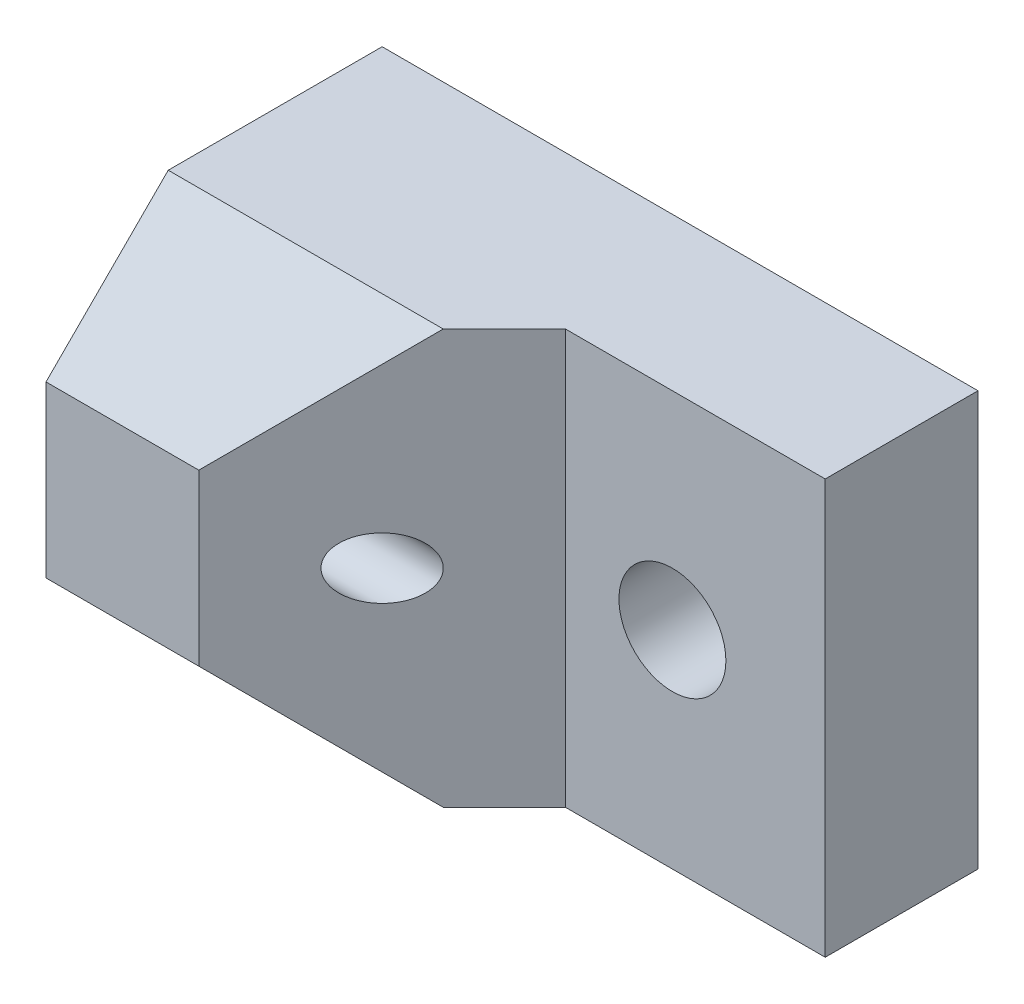
ISO-10303-21;
HEADER;
FILE_DESCRIPTION(('STEP AP214'),'2;1');
FILE_NAME('part.step','',(''),(''),'','','');
FILE_SCHEMA(('AUTOMOTIVE_DESIGN { 1 0 10303 214 1 1 1 1 }'));
ENDSEC;
DATA;
#1=APPLICATION_CONTEXT('core data for automotive mechanical design processes');
#2=APPLICATION_PROTOCOL_DEFINITION('international standard','automotive_design',2000,#1);
#3=PRODUCT_CONTEXT('',#1,'mechanical');
#4=PRODUCT('Part','Part','',(#3));
#5=PRODUCT_RELATED_PRODUCT_CATEGORY('part','',(#4));
#6=PRODUCT_DEFINITION_FORMATION('','',#4);
#7=PRODUCT_DEFINITION_CONTEXT('part definition',#1,'design');
#8=PRODUCT_DEFINITION('design','',#6,#7);
#9=PRODUCT_DEFINITION_SHAPE('','',#8);
#10=(LENGTH_UNIT() NAMED_UNIT(*) SI_UNIT(.MILLI.,.METRE.));
#11=(NAMED_UNIT(*) PLANE_ANGLE_UNIT() SI_UNIT($,.RADIAN.));
#12=(NAMED_UNIT(*) SI_UNIT($,.STERADIAN.) SOLID_ANGLE_UNIT());
#13=UNCERTAINTY_MEASURE_WITH_UNIT(LENGTH_MEASURE(1.E-05),#10,'distance_accuracy_value','');
#14=(GEOMETRIC_REPRESENTATION_CONTEXT(3) GLOBAL_UNCERTAINTY_ASSIGNED_CONTEXT((#13)) GLOBAL_UNIT_ASSIGNED_CONTEXT((#10,
#11,#12)) REPRESENTATION_CONTEXT('',''));
#15=CARTESIAN_POINT('',(0.,0.,0.));
#16=DIRECTION('',(0.,0.,1.));
#17=DIRECTION('',(1.,0.,0.));
#18=AXIS2_PLACEMENT_3D('',#15,#16,#17);
#19=CARTESIAN_POINT('',(0.,0.,5.));
#20=DIRECTION('',(0.,0.,1.));
#21=DIRECTION('',(1.,0.,0.));
#22=AXIS2_PLACEMENT_3D('',#19,#20,#21);
#23=PLANE('',#22);
#24=CARTESIAN_POINT('',(-20.9218584512682,-15.778174593052,5.));
#25=DIRECTION('',(0.,0.,1.));
#26=DIRECTION('',(1.,0.,0.));
#27=AXIS2_PLACEMENT_3D('',#24,#25,#26);
#28=CIRCLE('',#27,1.75);
#29=CARTESIAN_POINT('',(-19.1718584512682,-15.778174593052,5.));
#30=VERTEX_POINT('',#29);
#31=EDGE_CURVE('E161',#30,#30,#28,.T.);
#32=ORIENTED_EDGE('',*,*,#31,.F.);
#33=EDGE_LOOP('',(#32));
#34=FACE_BOUND('',#33,.T.);
#35=DIRECTION('',(-1.,0.,0.));
#36=VECTOR('',#35,1.);
#37=CARTESIAN_POINT('',(-35.4218584512682,-9.00000000000002,5.));
#38=LINE('',#37,#36);
#39=CARTESIAN_POINT('',(-15.9218584512682,-9.00000000000002,5.));
#40=VERTEX_POINT('',#39);
#41=CARTESIAN_POINT('',(-24.4218584512681,-9.00000000000002,5.));
#42=VERTEX_POINT('',#41);
#43=EDGE_CURVE('E175',#40,#42,#38,.T.);
#44=ORIENTED_EDGE('',*,*,#43,.T.);
#45=DIRECTION('',(0.,-1.,0.));
#46=VECTOR('',#45,1.);
#47=CARTESIAN_POINT('',(-24.4218584512681,0.,5.));
#48=LINE('',#47,#46);
#49=CARTESIAN_POINT('',(-24.4218584512681,-22.5563491861041,5.));
#50=VERTEX_POINT('',#49);
#51=EDGE_CURVE('E208',#42,#50,#48,.T.);
#52=ORIENTED_EDGE('',*,*,#51,.T.);
#53=DIRECTION('',(1.,0.,0.));
#54=VECTOR('',#53,1.);
#55=CARTESIAN_POINT('',(-35.4218584512682,-22.5563491861041,5.));
#56=LINE('',#55,#54);
#57=CARTESIAN_POINT('',(-15.9218584512682,-22.5563491861041,5.));
#58=VERTEX_POINT('',#57);
#59=EDGE_CURVE('E170',#50,#58,#56,.T.);
#60=ORIENTED_EDGE('',*,*,#59,.T.);
#61=DIRECTION('',(0.,1.,0.));
#62=VECTOR('',#61,1.);
#63=CARTESIAN_POINT('',(-15.9218584512682,-9.00000000000002,5.));
#64=LINE('',#63,#62);
#65=EDGE_CURVE('E172',#58,#40,#64,.T.);
#66=ORIENTED_EDGE('',*,*,#65,.T.);
#67=EDGE_LOOP('',(#44,#52,#60,#66));
#68=FACE_BOUND('',#67,.T.);
#69=ADVANCED_FACE('F39',(#34,#68),#23,.T.);
#70=CARTESIAN_POINT('',(0.,0.,0.));
#71=DIRECTION('',(0.,0.,1.));
#72=DIRECTION('',(1.,0.,0.));
#73=AXIS2_PLACEMENT_3D('',#70,#71,#72);
#74=PLANE('',#73);
#75=CARTESIAN_POINT('',(-20.9218584512682,-15.778174593052,0.));
#76=DIRECTION('',(0.,0.,1.));
#77=DIRECTION('',(1.,0.,0.));
#78=AXIS2_PLACEMENT_3D('',#75,#76,#77);
#79=CIRCLE('',#78,1.75);
#80=CARTESIAN_POINT('',(-19.1718584512682,-15.778174593052,0.));
#81=VERTEX_POINT('',#80);
#82=EDGE_CURVE('E158',#81,#81,#79,.T.);
#83=ORIENTED_EDGE('',*,*,#82,.T.);
#84=EDGE_LOOP('',(#83));
#85=FACE_BOUND('',#84,.T.);
#86=DIRECTION('',(-1.,0.,0.));
#87=VECTOR('',#86,1.);
#88=CARTESIAN_POINT('',(-29.4218584512682,-17.278174593052,0.));
#89=LINE('',#88,#87);
#90=CARTESIAN_POINT('',(-29.4218584512682,-17.278174593052,0.));
#91=VERTEX_POINT('',#90);
#92=CARTESIAN_POINT('',(-35.4218584512682,-17.278174593052,0.));
#93=VERTEX_POINT('',#92);
#94=EDGE_CURVE('E157',#91,#93,#89,.T.);
#95=ORIENTED_EDGE('',*,*,#94,.F.);
#96=DIRECTION('',(0.,-1.,0.));
#97=VECTOR('',#96,1.);
#98=CARTESIAN_POINT('',(-29.4218584512682,-17.278174593052,0.));
#99=LINE('',#98,#97);
#100=CARTESIAN_POINT('',(-29.4218584512682,-14.2781745930521,0.));
#101=VERTEX_POINT('',#100);
#102=EDGE_CURVE('E154',#101,#91,#99,.T.);
#103=ORIENTED_EDGE('',*,*,#102,.F.);
#104=DIRECTION('',(1.,0.,0.));
#105=VECTOR('',#104,1.);
#106=CARTESIAN_POINT('',(-29.4218584512682,-14.2781745930521,0.));
#107=LINE('',#106,#105);
#108=CARTESIAN_POINT('',(-35.4218584512682,-14.2781745930521,0.));
#109=VERTEX_POINT('',#108);
#110=EDGE_CURVE('E240',#109,#101,#107,.T.);
#111=ORIENTED_EDGE('',*,*,#110,.F.);
#112=DIRECTION('',(0.,-1.,0.));
#113=VECTOR('',#112,1.);
#114=CARTESIAN_POINT('',(-35.4218584512682,-9.00000000000002,0.));
#115=LINE('',#114,#113);
#116=CARTESIAN_POINT('',(-35.4218584512682,-9.00000000000002,0.));
#117=VERTEX_POINT('',#116);
#118=EDGE_CURVE('E179',#117,#109,#115,.T.);
#119=ORIENTED_EDGE('',*,*,#118,.F.);
#120=DIRECTION('',(-1.,0.,0.));
#121=VECTOR('',#120,1.);
#122=CARTESIAN_POINT('',(-35.4218584512682,-9.00000000000002,0.));
#123=LINE('',#122,#121);
#124=CARTESIAN_POINT('',(-15.9218584512682,-9.00000000000002,0.));
#125=VERTEX_POINT('',#124);
#126=EDGE_CURVE('E173',#125,#117,#123,.T.);
#127=ORIENTED_EDGE('',*,*,#126,.F.);
#128=DIRECTION('',(0.,1.,0.));
#129=VECTOR('',#128,1.);
#130=CARTESIAN_POINT('',(-15.9218584512682,-9.00000000000002,0.));
#131=LINE('',#130,#129);
#132=CARTESIAN_POINT('',(-15.9218584512682,-22.5563491861041,0.));
#133=VERTEX_POINT('',#132);
#134=EDGE_CURVE('E183',#133,#125,#131,.T.);
#135=ORIENTED_EDGE('',*,*,#134,.F.);
#136=DIRECTION('',(1.,0.,0.));
#137=VECTOR('',#136,1.);
#138=CARTESIAN_POINT('',(-35.4218584512682,-22.5563491861041,0.));
#139=LINE('',#138,#137);
#140=CARTESIAN_POINT('',(-35.4218584512682,-22.5563491861041,0.));
#141=VERTEX_POINT('',#140);
#142=EDGE_CURVE('E181',#141,#133,#139,.T.);
#143=ORIENTED_EDGE('',*,*,#142,.F.);
#144=EDGE_CURVE('E168',#93,#141,#115,.T.);
#145=ORIENTED_EDGE('',*,*,#144,.F.);
#146=EDGE_LOOP('',(#95,#103,#111,#119,#127,#135,#143,#145));
#147=FACE_BOUND('',#146,.T.);
#148=ADVANCED_FACE('F237',(#85,#147),#74,.F.);
#149=CARTESIAN_POINT('',(-35.4218584512682,-9.00000000000002,5.));
#150=DIRECTION('',(1.,0.,0.));
#151=DIRECTION('',(0.,0.,-1.));
#152=AXIS2_PLACEMENT_3D('',#149,#150,#151);
#153=PLANE('',#152);
#154=DIRECTION('',(0.,0.,-1.));
#155=VECTOR('',#154,1.);
#156=CARTESIAN_POINT('',(-35.4218584512682,-22.5563491861041,5.));
#157=LINE('',#156,#155);
#158=CARTESIAN_POINT('',(-35.4218584512682,-22.5563491861041,7.00000000000001));
#159=VERTEX_POINT('',#158);
#160=EDGE_CURVE('E194',#159,#141,#157,.T.);
#161=ORIENTED_EDGE('',*,*,#160,.F.);
#162=DIRECTION('',(0.,0.707106781186549,0.707106781186546));
#163=VECTOR('',#162,1.);
#164=CARTESIAN_POINT('',(-35.4218584512682,-22.5563491861041,7.00000000000001));
#165=LINE('',#164,#163);
#166=CARTESIAN_POINT('',(-35.4218584512682,-18.5563491861041,11.));
#167=VERTEX_POINT('',#166);
#168=EDGE_CURVE('E199',#159,#167,#165,.T.);
#169=ORIENTED_EDGE('',*,*,#168,.T.);
#170=DIRECTION('',(0.,1.,0.));
#171=VECTOR('',#170,1.);
#172=CARTESIAN_POINT('',(-35.4218584512682,-9.00000000000002,11.));
#173=LINE('',#172,#171);
#174=CARTESIAN_POINT('',(-35.4218584512682,-13.,11.));
#175=VERTEX_POINT('',#174);
#176=EDGE_CURVE('E265',#167,#175,#173,.T.);
#177=ORIENTED_EDGE('',*,*,#176,.T.);
#178=DIRECTION('',(0.,0.707106781186546,-0.707106781186549));
#179=VECTOR('',#178,1.);
#180=CARTESIAN_POINT('',(-35.4218584512682,-13.,11.));
#181=LINE('',#180,#179);
#182=CARTESIAN_POINT('',(-35.4218584512682,-9.00000000000002,6.99999999999998));
#183=VERTEX_POINT('',#182);
#184=EDGE_CURVE('E197',#175,#183,#181,.T.);
#185=ORIENTED_EDGE('',*,*,#184,.T.);
#186=DIRECTION('',(0.,0.,-1.));
#187=VECTOR('',#186,1.);
#188=CARTESIAN_POINT('',(-35.4218584512682,-9.00000000000002,5.));
#189=LINE('',#188,#187);
#190=EDGE_CURVE('E178',#183,#117,#189,.T.);
#191=ORIENTED_EDGE('',*,*,#190,.T.);
#192=ORIENTED_EDGE('',*,*,#118,.T.);
#193=DIRECTION('',(0.,0.,1.));
#194=VECTOR('',#193,1.);
#195=CARTESIAN_POINT('',(-35.4218584512682,-14.2781745930521,-2.));
#196=LINE('',#195,#194);
#197=CARTESIAN_POINT('',(-35.4218584512682,-14.2781745930521,-2.));
#198=VERTEX_POINT('',#197);
#199=EDGE_CURVE('E141',#198,#109,#196,.T.);
#200=ORIENTED_EDGE('',*,*,#199,.F.);
#201=DIRECTION('',(0.,1.,0.));
#202=VECTOR('',#201,1.);
#203=CARTESIAN_POINT('',(-35.4218584512682,-17.278174593052,-2.));
#204=LINE('',#203,#202);
#205=CARTESIAN_POINT('',(-35.4218584512682,-17.278174593052,-2.));
#206=VERTEX_POINT('',#205);
#207=EDGE_CURVE('E130',#206,#198,#204,.T.);
#208=ORIENTED_EDGE('',*,*,#207,.F.);
#209=DIRECTION('',(0.,0.,1.));
#210=VECTOR('',#209,1.);
#211=CARTESIAN_POINT('',(-35.4218584512682,-17.278174593052,-2.));
#212=LINE('',#211,#210);
#213=EDGE_CURVE('E137',#206,#93,#212,.T.);
#214=ORIENTED_EDGE('',*,*,#213,.T.);
#215=ORIENTED_EDGE('',*,*,#144,.T.);
#216=EDGE_LOOP('',(#161,#169,#177,#185,#191,#192,#200,#208,#214,#215));
#217=FACE_BOUND('',#216,.T.);
#218=CARTESIAN_POINT('',(-35.4218584512682,-15.778174593052,8.));
#219=DIRECTION('',(-1.,0.,0.));
#220=DIRECTION('',(0.,0.,1.));
#221=AXIS2_PLACEMENT_3D('',#218,#219,#220);
#222=CIRCLE('',#221,1.);
#223=CARTESIAN_POINT('',(-35.4218584512682,-15.778174593052,9.));
#224=VERTEX_POINT('',#223);
#225=EDGE_CURVE('E269',#224,#224,#222,.T.);
#226=ORIENTED_EDGE('',*,*,#225,.F.);
#227=EDGE_LOOP('',(#226));
#228=FACE_BOUND('',#227,.T.);
#229=ADVANCED_FACE('F133',(#217,#228),#153,.F.);
#230=CARTESIAN_POINT('',(-35.4218584512682,-22.5563491861041,5.));
#231=DIRECTION('',(0.,1.,0.));
#232=DIRECTION('',(0.,0.,1.));
#233=AXIS2_PLACEMENT_3D('',#230,#231,#232);
#234=PLANE('',#233);
#235=ORIENTED_EDGE('',*,*,#59,.F.);
#236=DIRECTION('',(-0.707106781186551,0.,0.707106781186544));
#237=VECTOR('',#236,1.);
#238=CARTESIAN_POINT('',(-29.9218584512682,-22.5563491861041,10.5));
#239=LINE('',#238,#237);
#240=CARTESIAN_POINT('',(-26.4218584512681,-22.5563491861041,7.00000000000001));
#241=VERTEX_POINT('',#240);
#242=EDGE_CURVE('E211',#50,#241,#239,.T.);
#243=ORIENTED_EDGE('',*,*,#242,.T.);
#244=DIRECTION('',(-1.,0.,0.));
#245=VECTOR('',#244,1.);
#246=CARTESIAN_POINT('',(-35.4218584512682,-22.5563491861041,7.00000000000001));
#247=LINE('',#246,#245);
#248=EDGE_CURVE('E63',#241,#159,#247,.T.);
#249=ORIENTED_EDGE('',*,*,#248,.T.);
#250=ORIENTED_EDGE('',*,*,#160,.T.);
#251=ORIENTED_EDGE('',*,*,#142,.T.);
#252=DIRECTION('',(0.,0.,-1.));
#253=VECTOR('',#252,1.);
#254=CARTESIAN_POINT('',(-15.9218584512682,-22.5563491861041,5.));
#255=LINE('',#254,#253);
#256=EDGE_CURVE('E191',#58,#133,#255,.T.);
#257=ORIENTED_EDGE('',*,*,#256,.F.);
#258=EDGE_LOOP('',(#235,#243,#249,#250,#251,#257));
#259=FACE_BOUND('',#258,.T.);
#260=ADVANCED_FACE('F259',(#259),#234,.F.);
#261=CARTESIAN_POINT('',(-15.9218584512682,-9.00000000000002,5.));
#262=DIRECTION('',(-1.,0.,0.));
#263=DIRECTION('',(0.,0.,1.));
#264=AXIS2_PLACEMENT_3D('',#261,#262,#263);
#265=PLANE('',#264);
#266=ORIENTED_EDGE('',*,*,#134,.T.);
#267=DIRECTION('',(0.,0.,-1.));
#268=VECTOR('',#267,1.);
#269=CARTESIAN_POINT('',(-15.9218584512682,-9.00000000000002,5.));
#270=LINE('',#269,#268);
#271=EDGE_CURVE('E188',#40,#125,#270,.T.);
#272=ORIENTED_EDGE('',*,*,#271,.F.);
#273=ORIENTED_EDGE('',*,*,#65,.F.);
#274=ORIENTED_EDGE('',*,*,#256,.T.);
#275=EDGE_LOOP('',(#266,#272,#273,#274));
#276=FACE_BOUND('',#275,.T.);
#277=ADVANCED_FACE('F232',(#276),#265,.F.);
#278=CARTESIAN_POINT('',(-35.4218584512682,-9.00000000000002,5.));
#279=DIRECTION('',(0.,-1.,0.));
#280=DIRECTION('',(0.,0.,-1.));
#281=AXIS2_PLACEMENT_3D('',#278,#279,#280);
#282=PLANE('',#281);
#283=ORIENTED_EDGE('',*,*,#190,.F.);
#284=DIRECTION('',(1.,0.,0.));
#285=VECTOR('',#284,1.);
#286=CARTESIAN_POINT('',(-30.4218584512682,-9.00000000000002,6.99999999999998));
#287=LINE('',#286,#285);
#288=CARTESIAN_POINT('',(-26.4218584512681,-9.00000000000002,6.99999999999998));
#289=VERTEX_POINT('',#288);
#290=EDGE_CURVE('E55',#183,#289,#287,.T.);
#291=ORIENTED_EDGE('',*,*,#290,.T.);
#292=DIRECTION('',(0.707106781186551,0.,-0.707106781186544));
#293=VECTOR('',#292,1.);
#294=CARTESIAN_POINT('',(-29.9218584512682,-9.00000000000002,10.5));
#295=LINE('',#294,#293);
#296=EDGE_CURVE('E11',#289,#42,#295,.T.);
#297=ORIENTED_EDGE('',*,*,#296,.T.);
#298=ORIENTED_EDGE('',*,*,#43,.F.);
#299=ORIENTED_EDGE('',*,*,#271,.T.);
#300=ORIENTED_EDGE('',*,*,#126,.T.);
#301=EDGE_LOOP('',(#283,#291,#297,#298,#299,#300));
#302=FACE_BOUND('',#301,.T.);
#303=ADVANCED_FACE('F225',(#302),#282,.F.);
#304=CARTESIAN_POINT('',(-20.9218584512682,-15.778174593052,5.));
#305=DIRECTION('',(0.,0.,-1.));
#306=DIRECTION('',(-1.,0.,0.));
#307=AXIS2_PLACEMENT_3D('',#304,#305,#306);
#308=CYLINDRICAL_SURFACE('',#307,1.75);
#309=ORIENTED_EDGE('',*,*,#31,.T.);
#310=EDGE_LOOP('',(#309));
#311=FACE_BOUND('',#310,.T.);
#312=ORIENTED_EDGE('',*,*,#82,.F.);
#313=EDGE_LOOP('',(#312));
#314=FACE_BOUND('',#313,.T.);
#315=ADVANCED_FACE('F292',(#311,#314),#308,.F.);
#316=CARTESIAN_POINT('',(-29.4218584512682,-17.278174593052,-2.));
#317=DIRECTION('',(0.,1.,0.));
#318=DIRECTION('',(0.,0.,1.));
#319=AXIS2_PLACEMENT_3D('',#316,#317,#318);
#320=PLANE('',#319);
#321=ORIENTED_EDGE('',*,*,#94,.T.);
#322=ORIENTED_EDGE('',*,*,#213,.F.);
#323=DIRECTION('',(-1.,0.,0.));
#324=VECTOR('',#323,1.);
#325=CARTESIAN_POINT('',(-29.4218584512682,-17.278174593052,-2.));
#326=LINE('',#325,#324);
#327=CARTESIAN_POINT('',(-29.4218584512682,-17.278174593052,-2.));
#328=VERTEX_POINT('',#327);
#329=EDGE_CURVE('E145',#328,#206,#326,.T.);
#330=ORIENTED_EDGE('',*,*,#329,.F.);
#331=DIRECTION('',(0.,0.,1.));
#332=VECTOR('',#331,1.);
#333=CARTESIAN_POINT('',(-29.4218584512682,-17.278174593052,-2.));
#334=LINE('',#333,#332);
#335=EDGE_CURVE('E246',#328,#91,#334,.T.);
#336=ORIENTED_EDGE('',*,*,#335,.T.);
#337=EDGE_LOOP('',(#321,#322,#330,#336));
#338=FACE_BOUND('',#337,.T.);
#339=ADVANCED_FACE('F156',(#338),#320,.F.);
#340=CARTESIAN_POINT('',(-29.4218584512682,-14.2781745930521,-2.));
#341=DIRECTION('',(0.,-1.,0.));
#342=DIRECTION('',(0.,0.,-1.));
#343=AXIS2_PLACEMENT_3D('',#340,#341,#342);
#344=PLANE('',#343);
#345=ORIENTED_EDGE('',*,*,#110,.T.);
#346=DIRECTION('',(0.,0.,1.));
#347=VECTOR('',#346,1.);
#348=CARTESIAN_POINT('',(-29.4218584512682,-14.2781745930521,-2.));
#349=LINE('',#348,#347);
#350=CARTESIAN_POINT('',(-29.4218584512682,-14.2781745930521,-2.));
#351=VERTEX_POINT('',#350);
#352=EDGE_CURVE('E163',#351,#101,#349,.T.);
#353=ORIENTED_EDGE('',*,*,#352,.F.);
#354=DIRECTION('',(1.,0.,0.));
#355=VECTOR('',#354,1.);
#356=CARTESIAN_POINT('',(-29.4218584512682,-14.2781745930521,-2.));
#357=LINE('',#356,#355);
#358=EDGE_CURVE('E144',#198,#351,#357,.T.);
#359=ORIENTED_EDGE('',*,*,#358,.F.);
#360=ORIENTED_EDGE('',*,*,#199,.T.);
#361=EDGE_LOOP('',(#345,#353,#359,#360));
#362=FACE_BOUND('',#361,.T.);
#363=ADVANCED_FACE('F242',(#362),#344,.F.);
#364=CARTESIAN_POINT('',(-29.4218584512682,-17.278174593052,-2.));
#365=DIRECTION('',(-1.,0.,0.));
#366=DIRECTION('',(0.,0.,1.));
#367=AXIS2_PLACEMENT_3D('',#364,#365,#366);
#368=PLANE('',#367);
#369=ORIENTED_EDGE('',*,*,#102,.T.);
#370=ORIENTED_EDGE('',*,*,#335,.F.);
#371=DIRECTION('',(0.,-1.,0.));
#372=VECTOR('',#371,1.);
#373=CARTESIAN_POINT('',(-29.4218584512682,-17.278174593052,-2.));
#374=LINE('',#373,#372);
#375=EDGE_CURVE('E150',#351,#328,#374,.T.);
#376=ORIENTED_EDGE('',*,*,#375,.F.);
#377=ORIENTED_EDGE('',*,*,#352,.T.);
#378=EDGE_LOOP('',(#369,#370,#376,#377));
#379=FACE_BOUND('',#378,.T.);
#380=ADVANCED_FACE('F255',(#379),#368,.F.);
#381=CARTESIAN_POINT('',(0.,0.,-2.));
#382=DIRECTION('',(0.,0.,-1.));
#383=DIRECTION('',(-1.,0.,0.));
#384=AXIS2_PLACEMENT_3D('',#381,#382,#383);
#385=PLANE('',#384);
#386=ORIENTED_EDGE('',*,*,#329,.T.);
#387=ORIENTED_EDGE('',*,*,#207,.T.);
#388=ORIENTED_EDGE('',*,*,#358,.T.);
#389=ORIENTED_EDGE('',*,*,#375,.T.);
#390=EDGE_LOOP('',(#386,#387,#388,#389));
#391=FACE_BOUND('',#390,.T.);
#392=ADVANCED_FACE('F148',(#391),#385,.T.);
#393=CARTESIAN_POINT('',(-30.4218584512682,-9.00000000000002,11.));
#394=DIRECTION('',(0.,0.,1.));
#395=DIRECTION('',(0.,-1.,0.));
#396=AXIS2_PLACEMENT_3D('',#393,#394,#395);
#397=PLANE('',#396);
#398=ORIENTED_EDGE('',*,*,#176,.F.);
#399=DIRECTION('',(1.,0.,0.));
#400=VECTOR('',#399,1.);
#401=CARTESIAN_POINT('',(-30.4218584512682,-18.5563491861041,11.));
#402=LINE('',#401,#400);
#403=CARTESIAN_POINT('',(-30.4218584512682,-18.5563491861041,11.));
#404=VERTEX_POINT('',#403);
#405=EDGE_CURVE('E204',#167,#404,#402,.T.);
#406=ORIENTED_EDGE('',*,*,#405,.T.);
#407=DIRECTION('',(0.,1.,0.));
#408=VECTOR('',#407,1.);
#409=CARTESIAN_POINT('',(-30.4218584512682,-9.00000000000002,11.));
#410=LINE('',#409,#408);
#411=CARTESIAN_POINT('',(-30.4218584512682,-13.,11.));
#412=VERTEX_POINT('',#411);
#413=EDGE_CURVE('E250',#404,#412,#410,.T.);
#414=ORIENTED_EDGE('',*,*,#413,.T.);
#415=DIRECTION('',(-1.,0.,0.));
#416=VECTOR('',#415,1.);
#417=CARTESIAN_POINT('',(-35.4218584512682,-13.,11.));
#418=LINE('',#417,#416);
#419=EDGE_CURVE('E201',#412,#175,#418,.T.);
#420=ORIENTED_EDGE('',*,*,#419,.T.);
#421=EDGE_LOOP('',(#398,#406,#414,#420));
#422=FACE_BOUND('',#421,.T.);
#423=ADVANCED_FACE('F264',(#422),#397,.T.);
#424=CARTESIAN_POINT('',(-30.4218584512682,-15.778174593052,8.));
#425=DIRECTION('',(-1.,0.,0.));
#426=DIRECTION('',(0.,0.,1.));
#427=AXIS2_PLACEMENT_3D('',#424,#425,#426);
#428=CYLINDRICAL_SURFACE('',#427,1.);
#429=CARTESIAN_POINT('',(-27.4218584512681,-15.778174593052,8.));
#430=DIRECTION('',(-0.707106781186544,0.,-0.707106781186551));
#431=DIRECTION('',(-0.707106781186551,0.,0.707106781186544));
#432=AXIS2_PLACEMENT_3D('',#429,#430,#431);
#433=ELLIPSE('',#432,1.4142135623731,1.);
#434=CARTESIAN_POINT('',(-28.4218584512682,-15.778174593052,9.));
#435=VERTEX_POINT('',#434);
#436=EDGE_CURVE('E44',#435,#435,#433,.T.);
#437=ORIENTED_EDGE('',*,*,#436,.F.);
#438=EDGE_LOOP('',(#437));
#439=FACE_BOUND('',#438,.T.);
#440=ORIENTED_EDGE('',*,*,#225,.T.);
#441=EDGE_LOOP('',(#440));
#442=FACE_BOUND('',#441,.T.);
#443=ADVANCED_FACE('F274',(#439,#442),#428,.F.);
#444=CARTESIAN_POINT('',(-35.4218584512682,-22.5563491861041,7.00000000000001));
#445=DIRECTION('',(0.,-0.707106781186546,0.707106781186549));
#446=DIRECTION('',(1.,0.,0.));
#447=AXIS2_PLACEMENT_3D('',#444,#445,#446);
#448=PLANE('',#447);
#449=ORIENTED_EDGE('',*,*,#248,.F.);
#450=DIRECTION('',(-0.577350269189629,0.577350269189626,0.577350269189623));
#451=VECTOR('',#450,1.);
#452=CARTESIAN_POINT('',(-32.6073081799695,-16.3708994574027,13.1854497287013));
#453=LINE('',#452,#451);
#454=EDGE_CURVE('E213',#241,#404,#453,.T.);
#455=ORIENTED_EDGE('',*,*,#454,.T.);
#456=ORIENTED_EDGE('',*,*,#405,.F.);
#457=ORIENTED_EDGE('',*,*,#168,.F.);
#458=EDGE_LOOP('',(#449,#455,#456,#457));
#459=FACE_BOUND('',#458,.T.);
#460=ADVANCED_FACE('F262',(#459),#448,.T.);
#461=CARTESIAN_POINT('',(-30.4218584512682,-13.,11.));
#462=DIRECTION('',(0.,0.707106781186549,0.707106781186546));
#463=DIRECTION('',(1.,0.,0.));
#464=AXIS2_PLACEMENT_3D('',#461,#462,#463);
#465=PLANE('',#464);
#466=ORIENTED_EDGE('',*,*,#419,.F.);
#467=DIRECTION('',(0.577350269189631,0.577350269189622,-0.577350269189625));
#468=VECTOR('',#467,1.);
#469=CARTESIAN_POINT('',(-22.0885251179348,-4.66666666666673,2.66666666666667));
#470=LINE('',#469,#468);
#471=EDGE_CURVE('E49',#412,#289,#470,.T.);
#472=ORIENTED_EDGE('',*,*,#471,.T.);
#473=ORIENTED_EDGE('',*,*,#290,.F.);
#474=ORIENTED_EDGE('',*,*,#184,.F.);
#475=EDGE_LOOP('',(#466,#472,#473,#474));
#476=FACE_BOUND('',#475,.T.);
#477=ADVANCED_FACE('F219',(#476),#465,.T.);
#478=CARTESIAN_POINT('',(-24.4218584512681,0.,5.));
#479=DIRECTION('',(-0.707106781186544,0.,-0.707106781186551));
#480=DIRECTION('',(0.,-1.,0.));
#481=AXIS2_PLACEMENT_3D('',#478,#479,#480);
#482=PLANE('',#481);
#483=ORIENTED_EDGE('',*,*,#471,.F.);
#484=ORIENTED_EDGE('',*,*,#413,.F.);
#485=ORIENTED_EDGE('',*,*,#454,.F.);
#486=ORIENTED_EDGE('',*,*,#242,.F.);
#487=ORIENTED_EDGE('',*,*,#51,.F.);
#488=ORIENTED_EDGE('',*,*,#296,.F.);
#489=EDGE_LOOP('',(#483,#484,#485,#486,#487,#488));
#490=FACE_BOUND('',#489,.T.);
#491=ORIENTED_EDGE('',*,*,#436,.T.);
#492=EDGE_LOOP('',(#491));
#493=FACE_BOUND('',#492,.T.);
#494=ADVANCED_FACE('F42',(#490,#493),#482,.F.);
#495=CLOSED_SHELL('',(#69,#148,#229,#260,#277,#303,#315,#339,#363,#380,#392,#423,#443,#460,#477,#494));
#496=MANIFOLD_SOLID_BREP('B2',#495);
#497=ADVANCED_BREP_SHAPE_REPRESENTATION('',(#18,#496),#14);
#498=SHAPE_DEFINITION_REPRESENTATION(#9,#497);
ENDSEC;
END-ISO-10303-21;
